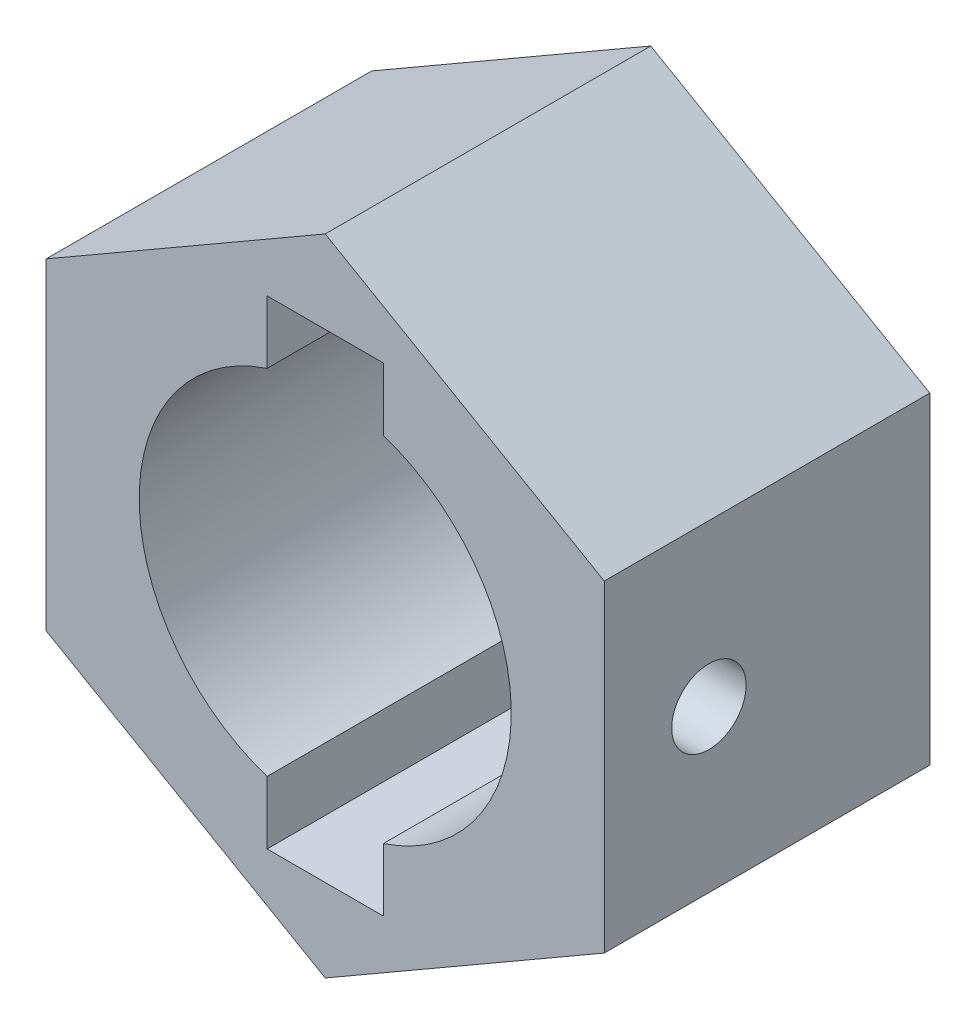
ISO-10303-21;
HEADER;
FILE_DESCRIPTION(('STEP AP214'),'2;1');
FILE_NAME('part.step','',(''),(''),'','','');
FILE_SCHEMA(('AUTOMOTIVE_DESIGN { 1 0 10303 214 1 1 1 1 }'));
ENDSEC;
DATA;
#1=APPLICATION_CONTEXT('core data for automotive mechanical design processes');
#2=APPLICATION_PROTOCOL_DEFINITION('international standard','automotive_design',2000,#1);
#3=PRODUCT_CONTEXT('',#1,'mechanical');
#4=PRODUCT('Part','Part','',(#3));
#5=PRODUCT_RELATED_PRODUCT_CATEGORY('part','',(#4));
#6=PRODUCT_DEFINITION_FORMATION('','',#4);
#7=PRODUCT_DEFINITION_CONTEXT('part definition',#1,'design');
#8=PRODUCT_DEFINITION('design','',#6,#7);
#9=PRODUCT_DEFINITION_SHAPE('','',#8);
#10=(LENGTH_UNIT() NAMED_UNIT(*) SI_UNIT(.MILLI.,.METRE.));
#11=(NAMED_UNIT(*) PLANE_ANGLE_UNIT() SI_UNIT($,.RADIAN.));
#12=(NAMED_UNIT(*) SI_UNIT($,.STERADIAN.) SOLID_ANGLE_UNIT());
#13=UNCERTAINTY_MEASURE_WITH_UNIT(LENGTH_MEASURE(1.E-05),#10,'distance_accuracy_value','');
#14=(GEOMETRIC_REPRESENTATION_CONTEXT(3) GLOBAL_UNCERTAINTY_ASSIGNED_CONTEXT((#13)) GLOBAL_UNIT_ASSIGNED_CONTEXT((#10,
#11,#12)) REPRESENTATION_CONTEXT('',''));
#15=CARTESIAN_POINT('',(0.,0.,0.));
#16=DIRECTION('',(0.,0.,1.));
#17=DIRECTION('',(1.,0.,0.));
#18=AXIS2_PLACEMENT_3D('',#15,#16,#17);
#19=CARTESIAN_POINT('',(12.,0.,14.));
#20=DIRECTION('',(-1.,0.,0.));
#21=DIRECTION('',(0.,-1.,0.));
#22=AXIS2_PLACEMENT_3D('',#19,#20,#21);
#23=PLANE('',#22);
#24=CARTESIAN_POINT('',(12.,0.,9.5));
#25=DIRECTION('',(1.,0.,0.));
#26=DIRECTION('',(0.,0.,-1.));
#27=AXIS2_PLACEMENT_3D('',#24,#25,#26);
#28=CIRCLE('',#27,1.6);
#29=CARTESIAN_POINT('',(12.,0.,7.9));
#30=VERTEX_POINT('',#29);
#31=EDGE_CURVE('E311',#30,#30,#28,.T.);
#32=ORIENTED_EDGE('',*,*,#31,.F.);
#33=EDGE_LOOP('',(#32));
#34=FACE_BOUND('',#33,.T.);
#35=DIRECTION('',(0.,1.,0.));
#36=VECTOR('',#35,1.);
#37=CARTESIAN_POINT('',(12.,0.,0.));
#38=LINE('',#37,#36);
#39=CARTESIAN_POINT('',(12.,-6.9282032302755,0.));
#40=VERTEX_POINT('',#39);
#41=CARTESIAN_POINT('',(12.,6.92820323027551,0.));
#42=VERTEX_POINT('',#41);
#43=EDGE_CURVE('E212',#40,#42,#38,.T.);
#44=ORIENTED_EDGE('',*,*,#43,.T.);
#45=DIRECTION('',(0.,0.,-1.));
#46=VECTOR('',#45,1.);
#47=CARTESIAN_POINT('',(12.,6.92820323027551,14.));
#48=LINE('',#47,#46);
#49=CARTESIAN_POINT('',(12.,6.92820323027551,14.));
#50=VERTEX_POINT('',#49);
#51=EDGE_CURVE('E11',#50,#42,#48,.T.);
#52=ORIENTED_EDGE('',*,*,#51,.F.);
#53=DIRECTION('',(0.,1.,0.));
#54=VECTOR('',#53,1.);
#55=CARTESIAN_POINT('',(12.,0.,14.));
#56=LINE('',#55,#54);
#57=CARTESIAN_POINT('',(12.,-6.9282032302755,14.));
#58=VERTEX_POINT('',#57);
#59=EDGE_CURVE('E397',#58,#50,#56,.T.);
#60=ORIENTED_EDGE('',*,*,#59,.F.);
#61=DIRECTION('',(0.,0.,-1.));
#62=VECTOR('',#61,1.);
#63=CARTESIAN_POINT('',(12.,-6.9282032302755,14.));
#64=LINE('',#63,#62);
#65=EDGE_CURVE('E229',#58,#40,#64,.T.);
#66=ORIENTED_EDGE('',*,*,#65,.T.);
#67=EDGE_LOOP('',(#44,#52,#60,#66));
#68=FACE_BOUND('',#67,.T.);
#69=ADVANCED_FACE('F42',(#34,#68),#23,.F.);
#70=CARTESIAN_POINT('',(6.00000000000001,10.3923048454133,14.));
#71=DIRECTION('',(-0.5,-0.866025403784438,0.));
#72=DIRECTION('',(0.866025403784438,-0.5,0.));
#73=AXIS2_PLACEMENT_3D('',#70,#71,#72);
#74=PLANE('',#73);
#75=DIRECTION('',(-0.866025403784438,0.5,0.));
#76=VECTOR('',#75,1.);
#77=CARTESIAN_POINT('',(6.00000000000001,10.3923048454133,0.));
#78=LINE('',#77,#76);
#79=CARTESIAN_POINT('',(0.,13.856406460551,0.));
#80=VERTEX_POINT('',#79);
#81=EDGE_CURVE('E216',#42,#80,#78,.T.);
#82=ORIENTED_EDGE('',*,*,#81,.T.);
#83=DIRECTION('',(0.,0.,-1.));
#84=VECTOR('',#83,1.);
#85=CARTESIAN_POINT('',(0.,13.856406460551,14.));
#86=LINE('',#85,#84);
#87=CARTESIAN_POINT('',(0.,13.856406460551,14.));
#88=VERTEX_POINT('',#87);
#89=EDGE_CURVE('E53',#88,#80,#86,.T.);
#90=ORIENTED_EDGE('',*,*,#89,.F.);
#91=DIRECTION('',(-0.866025403784438,0.5,0.));
#92=VECTOR('',#91,1.);
#93=CARTESIAN_POINT('',(6.00000000000001,10.3923048454133,14.));
#94=LINE('',#93,#92);
#95=EDGE_CURVE('E400',#50,#88,#94,.T.);
#96=ORIENTED_EDGE('',*,*,#95,.F.);
#97=ORIENTED_EDGE('',*,*,#51,.T.);
#98=EDGE_LOOP('',(#82,#90,#96,#97));
#99=FACE_BOUND('',#98,.T.);
#100=ADVANCED_FACE('F345',(#99),#74,.F.);
#101=CARTESIAN_POINT('',(-6.00000000000001,10.3923048454133,14.));
#102=DIRECTION('',(0.500000000000001,-0.866025403784438,0.));
#103=DIRECTION('',(0.866025403784438,0.500000000000001,0.));
#104=AXIS2_PLACEMENT_3D('',#101,#102,#103);
#105=PLANE('',#104);
#106=DIRECTION('',(-0.866025403784438,-0.500000000000001,0.));
#107=VECTOR('',#106,1.);
#108=CARTESIAN_POINT('',(-6.00000000000001,10.3923048454133,0.));
#109=LINE('',#108,#107);
#110=CARTESIAN_POINT('',(-12.,6.92820323027551,0.));
#111=VERTEX_POINT('',#110);
#112=EDGE_CURVE('E219',#80,#111,#109,.T.);
#113=ORIENTED_EDGE('',*,*,#112,.T.);
#114=DIRECTION('',(0.,0.,-1.));
#115=VECTOR('',#114,1.);
#116=CARTESIAN_POINT('',(-12.,6.92820323027551,14.));
#117=LINE('',#116,#115);
#118=CARTESIAN_POINT('',(-12.,6.92820323027551,14.));
#119=VERTEX_POINT('',#118);
#120=EDGE_CURVE('E172',#119,#111,#117,.T.);
#121=ORIENTED_EDGE('',*,*,#120,.F.);
#122=DIRECTION('',(-0.866025403784438,-0.500000000000001,0.));
#123=VECTOR('',#122,1.);
#124=CARTESIAN_POINT('',(-6.00000000000001,10.3923048454133,14.));
#125=LINE('',#124,#123);
#126=EDGE_CURVE('E161',#88,#119,#125,.T.);
#127=ORIENTED_EDGE('',*,*,#126,.F.);
#128=ORIENTED_EDGE('',*,*,#89,.T.);
#129=EDGE_LOOP('',(#113,#121,#127,#128));
#130=FACE_BOUND('',#129,.T.);
#131=ADVANCED_FACE('F351',(#130),#105,.F.);
#132=CARTESIAN_POINT('',(-12.,0.,14.));
#133=DIRECTION('',(1.,0.,0.));
#134=DIRECTION('',(0.,1.,0.));
#135=AXIS2_PLACEMENT_3D('',#132,#133,#134);
#136=PLANE('',#135);
#137=CARTESIAN_POINT('',(-12.,0.,2.));
#138=DIRECTION('',(-1.,0.,0.));
#139=DIRECTION('',(0.,0.,1.));
#140=AXIS2_PLACEMENT_3D('',#137,#138,#139);
#141=CIRCLE('',#140,0.799999999999999);
#142=CARTESIAN_POINT('',(-12.,0.,2.8));
#143=VERTEX_POINT('',#142);
#144=EDGE_CURVE('E321',#143,#143,#141,.T.);
#145=ORIENTED_EDGE('',*,*,#144,.F.);
#146=EDGE_LOOP('',(#145));
#147=FACE_BOUND('',#146,.T.);
#148=DIRECTION('',(0.,-1.,0.));
#149=VECTOR('',#148,1.);
#150=CARTESIAN_POINT('',(-12.,0.,0.));
#151=LINE('',#150,#149);
#152=CARTESIAN_POINT('',(-12.,-6.92820323027551,0.));
#153=VERTEX_POINT('',#152);
#154=EDGE_CURVE('E170',#111,#153,#151,.T.);
#155=ORIENTED_EDGE('',*,*,#154,.T.);
#156=DIRECTION('',(0.,0.,-1.));
#157=VECTOR('',#156,1.);
#158=CARTESIAN_POINT('',(-12.,-6.92820323027551,14.));
#159=LINE('',#158,#157);
#160=CARTESIAN_POINT('',(-12.,-6.92820323027551,14.));
#161=VERTEX_POINT('',#160);
#162=EDGE_CURVE('E167',#161,#153,#159,.T.);
#163=ORIENTED_EDGE('',*,*,#162,.F.);
#164=DIRECTION('',(0.,-1.,0.));
#165=VECTOR('',#164,1.);
#166=CARTESIAN_POINT('',(-12.,0.,14.));
#167=LINE('',#166,#165);
#168=EDGE_CURVE('E155',#119,#161,#167,.T.);
#169=ORIENTED_EDGE('',*,*,#168,.F.);
#170=ORIENTED_EDGE('',*,*,#120,.T.);
#171=EDGE_LOOP('',(#155,#163,#169,#170));
#172=FACE_BOUND('',#171,.T.);
#173=ADVANCED_FACE('F168',(#147,#172),#136,.F.);
#174=CARTESIAN_POINT('',(-6.00000000000001,-10.3923048454133,14.));
#175=DIRECTION('',(0.5,0.866025403784438,0.));
#176=DIRECTION('',(-0.866025403784438,0.5,0.));
#177=AXIS2_PLACEMENT_3D('',#174,#175,#176);
#178=PLANE('',#177);
#179=DIRECTION('',(0.866025403784438,-0.5,0.));
#180=VECTOR('',#179,1.);
#181=CARTESIAN_POINT('',(-6.00000000000001,-10.3923048454133,0.));
#182=LINE('',#181,#180);
#183=CARTESIAN_POINT('',(0.,-13.856406460551,0.));
#184=VERTEX_POINT('',#183);
#185=EDGE_CURVE('E109',#153,#184,#182,.T.);
#186=ORIENTED_EDGE('',*,*,#185,.T.);
#187=DIRECTION('',(0.,0.,-1.));
#188=VECTOR('',#187,1.);
#189=CARTESIAN_POINT('',(0.,-13.856406460551,14.));
#190=LINE('',#189,#188);
#191=CARTESIAN_POINT('',(0.,-13.856406460551,14.));
#192=VERTEX_POINT('',#191);
#193=EDGE_CURVE('E173',#192,#184,#190,.T.);
#194=ORIENTED_EDGE('',*,*,#193,.F.);
#195=DIRECTION('',(0.866025403784438,-0.5,0.));
#196=VECTOR('',#195,1.);
#197=CARTESIAN_POINT('',(-6.00000000000001,-10.3923048454133,14.));
#198=LINE('',#197,#196);
#199=EDGE_CURVE('E159',#161,#192,#198,.T.);
#200=ORIENTED_EDGE('',*,*,#199,.F.);
#201=ORIENTED_EDGE('',*,*,#162,.T.);
#202=EDGE_LOOP('',(#186,#194,#200,#201));
#203=FACE_BOUND('',#202,.T.);
#204=ADVANCED_FACE('F175',(#203),#178,.F.);
#205=CARTESIAN_POINT('',(0.,0.,14.));
#206=DIRECTION('',(0.,0.,-1.));
#207=DIRECTION('',(-1.,0.,0.));
#208=AXIS2_PLACEMENT_3D('',#205,#206,#207);
#209=CYLINDRICAL_SURFACE('',#208,8.);
#210=CARTESIAN_POINT('',(-8.,0.,2.8));
#211=CARTESIAN_POINT('',(-7.99999948416616,-0.0448162830332487,2.79999805927969));
#212=CARTESIAN_POINT('',(-7.99961940476965,-0.0896621961342213,2.79622138488284));
#213=CARTESIAN_POINT('',(-7.9981397407579,-0.178110718797472,2.78121250376766));
#214=CARTESIAN_POINT('',(-7.99703936347221,-0.221711903335065,2.76997208318033));
#215=CARTESIAN_POINT('',(-7.99424331650456,-0.306377340362734,2.74036620752173));
#216=CARTESIAN_POINT('',(-7.99254800640566,-0.34744310769193,2.72200505558522));
#217=CARTESIAN_POINT('',(-7.98875165915445,-0.425900928768328,2.67868727365468));
#218=CARTESIAN_POINT('',(-7.98665070270505,-0.463293711023264,2.65373195519989));
#219=CARTESIAN_POINT('',(-7.98226995473059,-0.533487640539268,2.59783784187018));
#220=CARTESIAN_POINT('',(-7.97998961259092,-0.566273715867916,2.56688016047837));
#221=CARTESIAN_POINT('',(-7.9755116552501,-0.626194017144789,2.49990037258957));
#222=CARTESIAN_POINT('',(-7.97331404387934,-0.653327981666124,2.46387803196609));
#223=CARTESIAN_POINT('',(-7.96924473242227,-0.701227176354895,2.3876971746531));
#224=CARTESIAN_POINT('',(-7.96737373368724,-0.721978772363906,2.34753004472411));
#225=CARTESIAN_POINT('',(-7.9641763003722,-0.75643710779421,2.26425953127602));
#226=CARTESIAN_POINT('',(-7.96284985233778,-0.770144021273035,2.22115622033284));
#227=CARTESIAN_POINT('',(-7.96089667258382,-0.790079233281517,2.13339055930719));
#228=CARTESIAN_POINT('',(-7.96026760318477,-0.796332522403038,2.08873393851823));
#229=CARTESIAN_POINT('',(-7.9597731444842,-0.80126022810829,1.99900090928338));
#230=CARTESIAN_POINT('',(-7.95990773510997,-0.799934843896643,1.95392451190235));
#231=CARTESIAN_POINT('',(-7.96092325519148,-0.789763424202145,1.86480375224535));
#232=CARTESIAN_POINT('',(-7.96180147672521,-0.780944675299644,1.82075624053704));
#233=CARTESIAN_POINT('',(-7.96420107429935,-0.756079315320471,1.73476962943913));
#234=CARTESIAN_POINT('',(-7.96572245902794,-0.740032606604599,1.69283055853998));
#235=CARTESIAN_POINT('',(-7.96924007561656,-0.701136715105208,1.61216513016089));
#236=CARTESIAN_POINT('',(-7.97123715126526,-0.678275426175985,1.57344464840855));
#237=CARTESIAN_POINT('',(-7.97548041386303,-0.626408021882584,1.50037982807049));
#238=CARTESIAN_POINT('',(-7.97772660810228,-0.597401726669206,1.46603561761459));
#239=CARTESIAN_POINT('',(-7.98222708250391,-0.533915289929657,1.40253968480878));
#240=CARTESIAN_POINT('',(-7.98448135466398,-0.499411583081093,1.37341151849536));
#241=CARTESIAN_POINT('',(-7.98873463262815,-0.425991585389692,1.32135709367169));
#242=CARTESIAN_POINT('',(-7.99073363814605,-0.387075289599683,1.29843084211482));
#243=CARTESIAN_POINT('',(-7.99425180533677,-0.305918484553894,1.2594319837518));
#244=CARTESIAN_POINT('',(-7.99577088331816,-0.263677397111925,1.24336057214555));
#245=CARTESIAN_POINT('',(-7.99815717953127,-0.177077773863948,1.2185448666306));
#246=CARTESIAN_POINT('',(-7.99902441725651,-0.132719301421283,1.2098003536075));
#247=CARTESIAN_POINT('',(-8.00000681334649,-0.0433480792735259,1.19991655381219));
#248=CARTESIAN_POINT('',(-8.00012518614188,0.00166104168439061,1.198744761398));
#249=CARTESIAN_POINT('',(-7.99960513405438,0.0912350346525567,1.20395429043901));
#250=CARTESIAN_POINT('',(-7.99896671939575,0.135799912656373,1.21033550985223));
#251=CARTESIAN_POINT('',(-7.99700689231355,0.223126565467736,1.23044295633726));
#252=CARTESIAN_POINT('',(-7.99568689534431,0.265891879177612,1.24415396358241));
#253=CARTESIAN_POINT('',(-7.99251199088487,0.348515457107022,1.27851613922982));
#254=CARTESIAN_POINT('',(-7.99065707140203,0.38837365612569,1.29916746323152));
#255=CARTESIAN_POINT('',(-7.98661180264338,0.46419854413771,1.34690467093113));
#256=CARTESIAN_POINT('',(-7.98442034882753,0.50015172779913,1.37401191114066));
#257=CARTESIAN_POINT('',(-7.97995146295616,0.567009298649499,1.43386085419274));
#258=CARTESIAN_POINT('',(-7.97767402874377,0.597913559079338,1.46660269845625));
#259=CARTESIAN_POINT('',(-7.97328019312604,0.653908887909712,1.5369332597272));
#260=CARTESIAN_POINT('',(-7.9711644011118,0.678978622943631,1.5745390052341));
#261=CARTESIAN_POINT('',(-7.96734265968712,0.722446606995058,1.65344588811735));
#262=CARTESIAN_POINT('',(-7.9656367046723,0.740844947243101,1.69474697495072));
#263=CARTESIAN_POINT('',(-7.9628315810724,0.770412166947576,1.77979899157264));
#264=CARTESIAN_POINT('',(-7.96173134759831,0.781593739849485,1.8235454720729));
#265=CARTESIAN_POINT('',(-7.96025892226301,0.796451205703566,1.91230655836862));
#266=CARTESIAN_POINT('',(-7.95988670952149,0.800127313919609,1.95732112775654));
#267=CARTESIAN_POINT('',(-7.9599129048605,0.799866510777001,2.04712855068536));
#268=CARTESIAN_POINT('',(-7.96030792069607,0.795963111674485,2.09192150630625));
#269=CARTESIAN_POINT('',(-7.96181683111637,0.780724362370918,2.18021193373463));
#270=CARTESIAN_POINT('',(-7.96293072650975,0.769389003809723,2.22370940408478));
#271=CARTESIAN_POINT('',(-7.9657509461055,0.739617349037998,2.30817387923829));
#272=CARTESIAN_POINT('',(-7.96745718832289,0.721182035472728,2.34914123330378));
#273=CARTESIAN_POINT('',(-7.97127001471487,0.677737243928831,2.42740551333683));
#274=CARTESIAN_POINT('',(-7.9733765966476,0.652727802764328,2.4647024598565));
#275=CARTESIAN_POINT('',(-7.97776389767758,0.596718845028261,2.53473893957755));
#276=CARTESIAN_POINT('',(-7.980045317814,0.565694359112211,2.56745846109367));
#277=CARTESIAN_POINT('',(-7.98451883783027,0.498585359380083,2.62724178615973));
#278=CARTESIAN_POINT('',(-7.98671091618381,0.462499635286602,2.65430423308574));
#279=CARTESIAN_POINT('',(-7.99076449655329,0.386193147329028,2.7020587630837));
#280=CARTESIAN_POINT('',(-7.9926251522145,0.345962199477407,2.72273463275614));
#281=CARTESIAN_POINT('',(-7.99579703399917,0.262606623280437,2.75700993825909));
#282=CARTESIAN_POINT('',(-7.99710887927723,0.219485319860484,2.77061735276284));
#283=CARTESIAN_POINT('',(-7.99870571018987,0.14676660912456,2.78697649366784));
#284=CARTESIAN_POINT('',(-7.99918880553466,0.117634042275604,2.79185363543948));
#285=CARTESIAN_POINT('',(-7.99983611960629,0.0590052646538476,2.79836602084941));
#286=CARTESIAN_POINT('',(-8.00000033964819,0.0295090553812434,2.80000127785749));
#287=CARTESIAN_POINT('',(-8.,0.,2.8));
#288=B_SPLINE_CURVE_WITH_KNOTS('',3,(#210,#211,#212,#213,#214,#215,#216,#217,#218,#219,#220,
#221,#222,#223,#224,#225,#226,#227,#228,#229,#230,#231,#232,#233,#234,#235,#236,#237,#238,#239,
#240,#241,#242,#243,#244,#245,#246,#247,#248,#249,#250,#251,#252,#253,#254,#255,#256,#257,#258,
#259,#260,#261,#262,#263,#264,#265,#266,#267,#268,#269,#270,#271,#272,#273,#274,#275,#276,#277,
#278,#279,#280,#281,#282,#283,#284,#285,#286,#287),.UNSPECIFIED.,.T.,.F.,(4,2,2,2,2,2,2,2,2,2,2,
2,2,2,2,2,2,2,2,2,2,2,2,2,2,2,2,2,2,2,2,2,2,2,2,2,2,2,4),(0.,0.134341093014779,
0.268830274268389,0.403238308585761,0.537619630066225,0.672430854898355,0.807248313765646,
0.942351803777773,1.07745195554003,1.21209785636157,1.34674021804621,1.48089437952888,
1.61505035329307,1.74944609098315,1.883845762649,2.01883787356965,2.15383013583817,
2.28884592554865,2.42385767740351,2.55828950886206,2.69271952415314,2.82687148235443,
2.96102644839573,3.09563152598958,3.23023998248183,3.36533314886878,3.50042446780299,
3.63527752474402,3.77012671391668,3.90438103435164,4.03863550580831,4.17287140290239,
4.30710654831167,4.44191133942122,4.57674842109565,4.71192504820993,4.84694875836235,
4.93540533785878,5.02386155255221),.UNSPECIFIED.);
#289=CARTESIAN_POINT('',(-8.,0.,2.8));
#290=VERTEX_POINT('',#289);
#291=EDGE_CURVE('E316',#290,#290,#288,.T.);
#292=ORIENTED_EDGE('',*,*,#291,.F.);
#293=EDGE_LOOP('',(#292));
#294=FACE_BOUND('',#293,.T.);
#295=CARTESIAN_POINT('',(0.,0.,0.));
#296=DIRECTION('',(0.,0.,1.));
#297=DIRECTION('',(1.,0.,0.));
#298=AXIS2_PLACEMENT_3D('',#295,#296,#297);
#299=CIRCLE('',#298,8.);
#300=CARTESIAN_POINT('',(-2.5,7.59934207678533,0.));
#301=VERTEX_POINT('',#300);
#302=CARTESIAN_POINT('',(-2.5,-7.59934207678533,0.));
#303=VERTEX_POINT('',#302);
#304=EDGE_CURVE('E184',#301,#303,#299,.T.);
#305=ORIENTED_EDGE('',*,*,#304,.F.);
#306=DIRECTION('',(0.,0.,-1.));
#307=VECTOR('',#306,1.);
#308=CARTESIAN_POINT('',(-2.5,7.59934207678533,14.));
#309=LINE('',#308,#307);
#310=CARTESIAN_POINT('',(-2.5,7.59934207678533,14.));
#311=VERTEX_POINT('',#310);
#312=EDGE_CURVE('E46',#311,#301,#309,.T.);
#313=ORIENTED_EDGE('',*,*,#312,.F.);
#314=CARTESIAN_POINT('',(0.,0.,14.));
#315=DIRECTION('',(0.,0.,1.));
#316=DIRECTION('',(1.,0.,0.));
#317=AXIS2_PLACEMENT_3D('',#314,#315,#316);
#318=CIRCLE('',#317,8.);
#319=CARTESIAN_POINT('',(-2.5,-7.59934207678533,14.));
#320=VERTEX_POINT('',#319);
#321=EDGE_CURVE('E228',#311,#320,#318,.T.);
#322=ORIENTED_EDGE('',*,*,#321,.T.);
#323=DIRECTION('',(0.,0.,-1.));
#324=VECTOR('',#323,1.);
#325=CARTESIAN_POINT('',(-2.5,-7.59934207678533,14.));
#326=LINE('',#325,#324);
#327=EDGE_CURVE('E180',#320,#303,#326,.T.);
#328=ORIENTED_EDGE('',*,*,#327,.T.);
#329=EDGE_LOOP('',(#305,#313,#322,#328));
#330=FACE_BOUND('',#329,.T.);
#331=ADVANCED_FACE('F275',(#294,#330),#209,.F.);
#332=CARTESIAN_POINT('',(-2.5,0.,14.));
#333=DIRECTION('',(-1.,0.,0.));
#334=DIRECTION('',(0.,0.,1.));
#335=AXIS2_PLACEMENT_3D('',#332,#333,#334);
#336=PLANE('',#335);
#337=DIRECTION('',(0.,1.,0.));
#338=VECTOR('',#337,1.);
#339=CARTESIAN_POINT('',(-2.5,0.,0.));
#340=LINE('',#339,#338);
#341=CARTESIAN_POINT('',(-2.5,10.3,0.));
#342=VERTEX_POINT('',#341);
#343=EDGE_CURVE('E188',#301,#342,#340,.T.);
#344=ORIENTED_EDGE('',*,*,#343,.T.);
#345=DIRECTION('',(0.,0.,-1.));
#346=VECTOR('',#345,1.);
#347=CARTESIAN_POINT('',(-2.5,10.3,14.));
#348=LINE('',#347,#346);
#349=CARTESIAN_POINT('',(-2.5,10.3,14.));
#350=VERTEX_POINT('',#349);
#351=EDGE_CURVE('E256',#350,#342,#348,.T.);
#352=ORIENTED_EDGE('',*,*,#351,.F.);
#353=DIRECTION('',(0.,1.,0.));
#354=VECTOR('',#353,1.);
#355=CARTESIAN_POINT('',(-2.5,0.,14.));
#356=LINE('',#355,#354);
#357=EDGE_CURVE('E268',#311,#350,#356,.T.);
#358=ORIENTED_EDGE('',*,*,#357,.F.);
#359=ORIENTED_EDGE('',*,*,#312,.T.);
#360=EDGE_LOOP('',(#344,#352,#358,#359));
#361=FACE_BOUND('',#360,.T.);
#362=ADVANCED_FACE('F44',(#361),#336,.F.);
#363=CARTESIAN_POINT('',(0.,10.3,14.));
#364=DIRECTION('',(0.,1.,0.));
#365=DIRECTION('',(0.,0.,1.));
#366=AXIS2_PLACEMENT_3D('',#363,#364,#365);
#367=PLANE('',#366);
#368=DIRECTION('',(1.,0.,0.));
#369=VECTOR('',#368,1.);
#370=CARTESIAN_POINT('',(0.,10.3,0.));
#371=LINE('',#370,#369);
#372=CARTESIAN_POINT('',(2.5,10.3,0.));
#373=VERTEX_POINT('',#372);
#374=EDGE_CURVE('E193',#342,#373,#371,.T.);
#375=ORIENTED_EDGE('',*,*,#374,.T.);
#376=DIRECTION('',(0.,0.,-1.));
#377=VECTOR('',#376,1.);
#378=CARTESIAN_POINT('',(2.5,10.3,14.));
#379=LINE('',#378,#377);
#380=CARTESIAN_POINT('',(2.5,10.3,14.));
#381=VERTEX_POINT('',#380);
#382=EDGE_CURVE('E253',#381,#373,#379,.T.);
#383=ORIENTED_EDGE('',*,*,#382,.F.);
#384=DIRECTION('',(1.,0.,0.));
#385=VECTOR('',#384,1.);
#386=CARTESIAN_POINT('',(0.,10.3,14.));
#387=LINE('',#386,#385);
#388=EDGE_CURVE('E382',#350,#381,#387,.T.);
#389=ORIENTED_EDGE('',*,*,#388,.F.);
#390=ORIENTED_EDGE('',*,*,#351,.T.);
#391=EDGE_LOOP('',(#375,#383,#389,#390));
#392=FACE_BOUND('',#391,.T.);
#393=ADVANCED_FACE('F370',(#392),#367,.F.);
#394=CARTESIAN_POINT('',(2.5,0.,14.));
#395=DIRECTION('',(1.,0.,0.));
#396=DIRECTION('',(0.,1.,0.));
#397=AXIS2_PLACEMENT_3D('',#394,#395,#396);
#398=PLANE('',#397);
#399=DIRECTION('',(0.,-1.,0.));
#400=VECTOR('',#399,1.);
#401=CARTESIAN_POINT('',(2.5,0.,0.));
#402=LINE('',#401,#400);
#403=CARTESIAN_POINT('',(2.5,7.59934207678533,0.));
#404=VERTEX_POINT('',#403);
#405=EDGE_CURVE('E196',#373,#404,#402,.T.);
#406=ORIENTED_EDGE('',*,*,#405,.T.);
#407=DIRECTION('',(0.,0.,-1.));
#408=VECTOR('',#407,1.);
#409=CARTESIAN_POINT('',(2.5,7.59934207678533,14.));
#410=LINE('',#409,#408);
#411=CARTESIAN_POINT('',(2.5,7.59934207678533,14.));
#412=VERTEX_POINT('',#411);
#413=EDGE_CURVE('E250',#412,#404,#410,.T.);
#414=ORIENTED_EDGE('',*,*,#413,.F.);
#415=DIRECTION('',(0.,-1.,0.));
#416=VECTOR('',#415,1.);
#417=CARTESIAN_POINT('',(2.5,0.,14.));
#418=LINE('',#417,#416);
#419=EDGE_CURVE('E378',#381,#412,#418,.T.);
#420=ORIENTED_EDGE('',*,*,#419,.F.);
#421=ORIENTED_EDGE('',*,*,#382,.T.);
#422=EDGE_LOOP('',(#406,#414,#420,#421));
#423=FACE_BOUND('',#422,.T.);
#424=ADVANCED_FACE('F367',(#423),#398,.F.);
#425=CARTESIAN_POINT('',(8.,0.,7.9));
#426=CARTESIAN_POINT('',(7.99999836129394,-0.0889230508682048,7.90000327119735));
#427=CARTESIAN_POINT('',(7.9985021628517,-0.177887456322427,7.90743814874823));
#428=CARTESIAN_POINT('',(7.9926778499717,-0.353301612302422,7.93695760018439));
#429=CARTESIAN_POINT('',(7.98834748576298,-0.43974930806616,7.95905381248242));
#430=CARTESIAN_POINT('',(7.97733838845259,-0.607568488421292,8.01718603779326));
#431=CARTESIAN_POINT('',(7.97066190522749,-0.688944748693006,8.0532086989515));
#432=CARTESIAN_POINT('',(7.95568636856503,-0.844492782182752,8.13813159601807));
#433=CARTESIAN_POINT('',(7.94738741177131,-0.918664984121289,8.18703106497153));
#434=CARTESIAN_POINT('',(7.92995464527952,-1.05870956370377,8.2970215908663));
#435=CARTESIAN_POINT('',(7.92081192806956,-1.12447032185363,8.35825336862592));
#436=CARTESIAN_POINT('',(7.90278688724142,-1.24485881057284,8.49086786622672));
#437=CARTESIAN_POINT('',(7.89390458400678,-1.29948567163267,8.56225137813619));
#438=CARTESIAN_POINT('',(7.87731906900185,-1.39653080535618,8.713945908819));
#439=CARTESIAN_POINT('',(7.86962731783914,-1.43883350218538,8.79433223007418));
#440=CARTESIAN_POINT('',(7.85642028893469,-1.50928906652848,8.96125091040653));
#441=CARTESIAN_POINT('',(7.85090479619139,-1.53744333189957,9.04778266135415));
#442=CARTESIAN_POINT('',(7.84276488403527,-1.57844047981571,9.22333498225267));
#443=CARTESIAN_POINT('',(7.840103521715,-1.59147919673403,9.31230807062756));
#444=CARTESIAN_POINT('',(7.83786200097004,-1.60248340436178,9.49121571418295));
#445=CARTESIAN_POINT('',(7.83828152748545,-1.60045043634159,9.58115017011223));
#446=CARTESIAN_POINT('',(7.84212081837096,-1.5815273169629,9.75799486083361));
#447=CARTESIAN_POINT('',(7.84549524574022,-1.56486166439024,9.8449302490037));
#448=CARTESIAN_POINT('',(7.85479273856002,-1.51750061539687,10.0147457226608));
#449=CARTESIAN_POINT('',(7.86071592572446,-1.48680454896108,10.0976256142704));
#450=CARTESIAN_POINT('',(7.87448989600653,-1.41203965387954,10.2576244187258));
#451=CARTESIAN_POINT('',(7.88235343701927,-1.36788184197137,10.3347006073107));
#452=CARTESIAN_POINT('',(7.89911390036899,-1.26750971931628,10.4804333599565));
#453=CARTESIAN_POINT('',(7.90801094141386,-1.21129402297092,10.5490889549619));
#454=CARTESIAN_POINT('',(7.92603233986339,-1.08719989529693,10.6773270439311));
#455=CARTESIAN_POINT('',(7.93515790737448,-1.0191298579399,10.7367241085746));
#456=CARTESIAN_POINT('',(7.95246157943054,-0.873896038499206,10.843286154082));
#457=CARTESIAN_POINT('',(7.96063967182358,-0.796732139807013,10.8904509780697));
#458=CARTESIAN_POINT('',(7.97514704257419,-0.635295019006264,10.9712440147616));
#459=CARTESIAN_POINT('',(7.98147342157235,-0.551010911336471,11.0048510298313));
#460=CARTESIAN_POINT('',(7.99154254380573,-0.377838362317855,11.0573767584617));
#461=CARTESIAN_POINT('',(7.9952856000085,-0.288950480115911,11.0762972513178));
#462=CARTESIAN_POINT('',(7.99972274986989,-0.110687049003433,11.0986503260708));
#463=CARTESIAN_POINT('',(8.00046679443952,-0.0213445253209144,11.1023366712644));
#464=CARTESIAN_POINT('',(7.99896083088164,0.15667989470835,11.0948002256925));
#465=CARTESIAN_POINT('',(7.99671099106314,0.245361827910077,11.0835782730358));
#466=CARTESIAN_POINT('',(7.98950131212828,0.418729055914473,11.0467546023297));
#467=CARTESIAN_POINT('',(7.9845660224673,0.503443117343853,11.0212830904034));
#468=CARTESIAN_POINT('',(7.97253683297652,0.667397803999475,10.9568256277507));
#469=CARTESIAN_POINT('',(7.96544277142762,0.746638018620071,10.9178386645171));
#470=CARTESIAN_POINT('',(7.94975858453271,0.898465877897956,10.8269080149579));
#471=CARTESIAN_POINT('',(7.94115120699283,0.970960202803509,10.7748115503377));
#472=CARTESIAN_POINT('',(7.92343575727812,1.10626883059074,10.6593452940684));
#473=CARTESIAN_POINT('',(7.9143276314942,1.16908209428923,10.5959742937602));
#474=CARTESIAN_POINT('',(7.89646885691144,1.28422494523869,10.4586026369742));
#475=CARTESIAN_POINT('',(7.88772576373287,1.33638032391786,10.3844548092459));
#476=CARTESIAN_POINT('',(7.87174706873911,1.42749667208194,10.2283018218293));
#477=CARTESIAN_POINT('',(7.86451140661348,1.46645816947665,10.1462969766823));
#478=CARTESIAN_POINT('',(7.85242784935012,1.52984294653114,9.97717080616072));
#479=CARTESIAN_POINT('',(7.84756759795498,1.55434159966569,9.89007865406349));
#480=CARTESIAN_POINT('',(7.8407589886724,1.58833384260352,9.71290647441455));
#481=CARTESIAN_POINT('',(7.83881025105778,1.59782938916019,9.62282683806504));
#482=CARTESIAN_POINT('',(7.83806639410206,1.60147345738796,9.44398581672909));
#483=CARTESIAN_POINT('',(7.83921470702881,1.59589726091344,9.35523016171678));
#484=CARTESIAN_POINT('',(7.84440917575382,1.5701636865601,9.17994936015196));
#485=CARTESIAN_POINT('',(7.8484553082747,1.55000642580688,9.09342419568831));
#486=CARTESIAN_POINT('',(7.85896422750654,1.49580570959833,8.92523566201513));
#487=CARTESIAN_POINT('',(7.86542113630129,1.46179601074776,8.84356102319614));
#488=CARTESIAN_POINT('',(7.88002743958672,1.38088743136257,8.6870340468249));
#489=CARTESIAN_POINT('',(7.8881769759823,1.33398747003982,8.61218228203978));
#490=CARTESIAN_POINT('',(7.9054233683716,1.22768946365827,8.4700550845595));
#491=CARTESIAN_POINT('',(7.91453396655519,1.1680926195763,8.40292997557185));
#492=CARTESIAN_POINT('',(7.93257730995127,1.03850299042103,8.27954207115333));
#493=CARTESIAN_POINT('',(7.94151001381095,0.968507819445344,8.22328177549237));
#494=CARTESIAN_POINT('',(7.95830131820754,0.819228206541203,8.12266456968569));
#495=CARTESIAN_POINT('',(7.96614769950794,0.739854215087744,8.07843839475196));
#496=CARTESIAN_POINT('',(7.97976200136,0.574666177505181,8.00402220384545));
#497=CARTESIAN_POINT('',(7.98553179421785,0.488858017381011,7.97381953674801));
#498=CARTESIAN_POINT('',(7.99322196152593,0.335714382278056,7.93415688312846));
#499=CARTESIAN_POINT('',(7.99574885053523,0.269250662422065,7.92137089006759));
#500=CARTESIAN_POINT('',(7.99913846623828,0.135199240336116,7.90429134022662));
#501=CARTESIAN_POINT('',(8.00000124597048,0.0676115739977991,7.89999751278437));
#502=CARTESIAN_POINT('',(8.,0.,7.9));
#503=B_SPLINE_CURVE_WITH_KNOTS('',3,(#425,#426,#427,#428,#429,#430,#431,#432,#433,#434,#435,
#436,#437,#438,#439,#440,#441,#442,#443,#444,#445,#446,#447,#448,#449,#450,#451,#452,#453,#454,
#455,#456,#457,#458,#459,#460,#461,#462,#463,#464,#465,#466,#467,#468,#469,#470,#471,#472,#473,
#474,#475,#476,#477,#478,#479,#480,#481,#482,#483,#484,#485,#486,#487,#488,#489,#490,#491,#492,
#493,#494,#495,#496,#497,#498,#499,#500,#501,#502),.UNSPECIFIED.,.T.,.F.,(4,2,2,2,2,2,2,2,2,2,2,
2,2,2,2,2,2,2,2,2,2,2,2,2,2,2,2,2,2,2,2,2,2,2,2,2,2,2,4),(0.,0.266521809058013,
0.533255441106116,0.799733976400546,1.06619664356938,1.3358922721795,1.60560895479578,
1.87777912009476,2.14992238984316,2.4184989616574,2.6870480684996,2.95154763210045,
3.21605982805967,3.48235984325748,3.74869047599473,4.01981203986161,4.29093708063712,
4.56248439766438,4.83399881116857,5.10097177082024,5.36792972252588,5.63248726321157,
5.89706462745636,6.16488105653373,6.43272621353488,6.70465005726761,6.97656301957546,
7.24704609652357,7.51749389328663,7.78303556108322,8.04857509588173,8.31347138004975,
8.57838988130986,8.84780921982628,9.11729047252688,9.38959194681019,9.66164728828029,
9.8643004046383,10.0669470619359),.UNSPECIFIED.);
#504=CARTESIAN_POINT('',(8.,0.,7.9));
#505=VERTEX_POINT('',#504);
#506=EDGE_CURVE('E189',#505,#505,#503,.T.);
#507=ORIENTED_EDGE('',*,*,#506,.F.);
#508=EDGE_LOOP('',(#507));
#509=FACE_BOUND('',#508,.T.);
#510=CARTESIAN_POINT('',(2.5,-7.59934207678533,0.));
#511=VERTEX_POINT('',#510);
#512=EDGE_CURVE('E190',#511,#404,#299,.T.);
#513=ORIENTED_EDGE('',*,*,#512,.F.);
#514=DIRECTION('',(0.,0.,-1.));
#515=VECTOR('',#514,1.);
#516=CARTESIAN_POINT('',(2.5,-7.59934207678533,14.));
#517=LINE('',#516,#515);
#518=CARTESIAN_POINT('',(2.5,-7.59934207678533,14.));
#519=VERTEX_POINT('',#518);
#520=EDGE_CURVE('E247',#519,#511,#517,.T.);
#521=ORIENTED_EDGE('',*,*,#520,.F.);
#522=EDGE_CURVE('E381',#519,#412,#318,.T.);
#523=ORIENTED_EDGE('',*,*,#522,.T.);
#524=ORIENTED_EDGE('',*,*,#413,.T.);
#525=EDGE_LOOP('',(#513,#521,#523,#524));
#526=FACE_BOUND('',#525,.T.);
#527=ADVANCED_FACE('F298',(#509,#526),#209,.F.);
#528=CARTESIAN_POINT('',(2.49999999999999,0.,14.));
#529=DIRECTION('',(-1.,0.,0.));
#530=DIRECTION('',(0.,-1.,0.));
#531=AXIS2_PLACEMENT_3D('',#528,#529,#530);
#532=PLANE('',#531);
#533=DIRECTION('',(0.,1.,0.));
#534=VECTOR('',#533,1.);
#535=CARTESIAN_POINT('',(2.49999999999999,0.,0.));
#536=LINE('',#535,#534);
#537=CARTESIAN_POINT('',(2.5,-10.3,0.));
#538=VERTEX_POINT('',#537);
#539=EDGE_CURVE('E200',#538,#511,#536,.T.);
#540=ORIENTED_EDGE('',*,*,#539,.F.);
#541=DIRECTION('',(0.,0.,-1.));
#542=VECTOR('',#541,1.);
#543=CARTESIAN_POINT('',(2.5,-10.3,14.));
#544=LINE('',#543,#542);
#545=CARTESIAN_POINT('',(2.5,-10.3,14.));
#546=VERTEX_POINT('',#545);
#547=EDGE_CURVE('E244',#546,#538,#544,.T.);
#548=ORIENTED_EDGE('',*,*,#547,.F.);
#549=DIRECTION('',(0.,1.,0.));
#550=VECTOR('',#549,1.);
#551=CARTESIAN_POINT('',(2.49999999999999,0.,14.));
#552=LINE('',#551,#550);
#553=EDGE_CURVE('E294',#546,#519,#552,.T.);
#554=ORIENTED_EDGE('',*,*,#553,.T.);
#555=ORIENTED_EDGE('',*,*,#520,.T.);
#556=EDGE_LOOP('',(#540,#548,#554,#555));
#557=FACE_BOUND('',#556,.T.);
#558=ADVANCED_FACE('F292',(#557),#532,.T.);
#559=CARTESIAN_POINT('',(0.,-10.3,14.));
#560=DIRECTION('',(0.,1.,0.));
#561=DIRECTION('',(0.,0.,1.));
#562=AXIS2_PLACEMENT_3D('',#559,#560,#561);
#563=PLANE('',#562);
#564=DIRECTION('',(1.,0.,0.));
#565=VECTOR('',#564,1.);
#566=CARTESIAN_POINT('',(0.,-10.3,0.));
#567=LINE('',#566,#565);
#568=CARTESIAN_POINT('',(-2.5,-10.3,0.));
#569=VERTEX_POINT('',#568);
#570=EDGE_CURVE('E204',#569,#538,#567,.T.);
#571=ORIENTED_EDGE('',*,*,#570,.F.);
#572=DIRECTION('',(0.,0.,-1.));
#573=VECTOR('',#572,1.);
#574=CARTESIAN_POINT('',(-2.5,-10.3,14.));
#575=LINE('',#574,#573);
#576=CARTESIAN_POINT('',(-2.5,-10.3,14.));
#577=VERTEX_POINT('',#576);
#578=EDGE_CURVE('E241',#577,#569,#575,.T.);
#579=ORIENTED_EDGE('',*,*,#578,.F.);
#580=DIRECTION('',(1.,0.,0.));
#581=VECTOR('',#580,1.);
#582=CARTESIAN_POINT('',(0.,-10.3,14.));
#583=LINE('',#582,#581);
#584=EDGE_CURVE('E288',#577,#546,#583,.T.);
#585=ORIENTED_EDGE('',*,*,#584,.T.);
#586=ORIENTED_EDGE('',*,*,#547,.T.);
#587=EDGE_LOOP('',(#571,#579,#585,#586));
#588=FACE_BOUND('',#587,.T.);
#589=ADVANCED_FACE('F285',(#588),#563,.T.);
#590=CARTESIAN_POINT('',(-2.5,0.,14.));
#591=DIRECTION('',(1.,0.,0.));
#592=DIRECTION('',(0.,1.,0.));
#593=AXIS2_PLACEMENT_3D('',#590,#591,#592);
#594=PLANE('',#593);
#595=DIRECTION('',(0.,-1.,0.));
#596=VECTOR('',#595,1.);
#597=CARTESIAN_POINT('',(-2.5,0.,0.));
#598=LINE('',#597,#596);
#599=EDGE_CURVE('E208',#303,#569,#598,.T.);
#600=ORIENTED_EDGE('',*,*,#599,.F.);
#601=ORIENTED_EDGE('',*,*,#327,.F.);
#602=DIRECTION('',(0.,-1.,0.));
#603=VECTOR('',#602,1.);
#604=CARTESIAN_POINT('',(-2.5,0.,14.));
#605=LINE('',#604,#603);
#606=EDGE_CURVE('E280',#320,#577,#605,.T.);
#607=ORIENTED_EDGE('',*,*,#606,.T.);
#608=ORIENTED_EDGE('',*,*,#578,.T.);
#609=EDGE_LOOP('',(#600,#601,#607,#608));
#610=FACE_BOUND('',#609,.T.);
#611=ADVANCED_FACE('F279',(#610),#594,.T.);
#612=CARTESIAN_POINT('',(6.00000000000001,-10.3923048454133,14.));
#613=DIRECTION('',(-0.500000000000001,0.866025403784438,0.));
#614=DIRECTION('',(-0.866025403784438,-0.500000000000001,0.));
#615=AXIS2_PLACEMENT_3D('',#612,#613,#614);
#616=PLANE('',#615);
#617=DIRECTION('',(0.866025403784438,0.500000000000001,0.));
#618=VECTOR('',#617,1.);
#619=CARTESIAN_POINT('',(6.00000000000001,-10.3923048454133,0.));
#620=LINE('',#619,#618);
#621=EDGE_CURVE('E115',#184,#40,#620,.T.);
#622=ORIENTED_EDGE('',*,*,#621,.T.);
#623=ORIENTED_EDGE('',*,*,#65,.F.);
#624=DIRECTION('',(0.866025403784438,0.500000000000001,0.));
#625=VECTOR('',#624,1.);
#626=CARTESIAN_POINT('',(6.00000000000001,-10.3923048454133,14.));
#627=LINE('',#626,#625);
#628=EDGE_CURVE('E62',#192,#58,#627,.T.);
#629=ORIENTED_EDGE('',*,*,#628,.F.);
#630=ORIENTED_EDGE('',*,*,#193,.T.);
#631=EDGE_LOOP('',(#622,#623,#629,#630));
#632=FACE_BOUND('',#631,.T.);
#633=ADVANCED_FACE('F360',(#632),#616,.F.);
#634=CARTESIAN_POINT('',(0.,0.,14.));
#635=DIRECTION('',(0.,0.,1.));
#636=DIRECTION('',(1.,0.,0.));
#637=AXIS2_PLACEMENT_3D('',#634,#635,#636);
#638=PLANE('',#637);
#639=ORIENTED_EDGE('',*,*,#321,.F.);
#640=ORIENTED_EDGE('',*,*,#357,.T.);
#641=ORIENTED_EDGE('',*,*,#388,.T.);
#642=ORIENTED_EDGE('',*,*,#419,.T.);
#643=ORIENTED_EDGE('',*,*,#522,.F.);
#644=ORIENTED_EDGE('',*,*,#553,.F.);
#645=ORIENTED_EDGE('',*,*,#584,.F.);
#646=ORIENTED_EDGE('',*,*,#606,.F.);
#647=EDGE_LOOP('',(#639,#640,#641,#642,#643,#644,#645,#646));
#648=FACE_BOUND('',#647,.T.);
#649=ORIENTED_EDGE('',*,*,#59,.T.);
#650=ORIENTED_EDGE('',*,*,#95,.T.);
#651=ORIENTED_EDGE('',*,*,#126,.T.);
#652=ORIENTED_EDGE('',*,*,#168,.T.);
#653=ORIENTED_EDGE('',*,*,#199,.T.);
#654=ORIENTED_EDGE('',*,*,#628,.T.);
#655=EDGE_LOOP('',(#649,#650,#651,#652,#653,#654));
#656=FACE_BOUND('',#655,.T.);
#657=ADVANCED_FACE('F157',(#648,#656),#638,.T.);
#658=CARTESIAN_POINT('',(0.,0.,0.));
#659=DIRECTION('',(0.,0.,1.));
#660=DIRECTION('',(1.,0.,0.));
#661=AXIS2_PLACEMENT_3D('',#658,#659,#660);
#662=PLANE('',#661);
#663=ORIENTED_EDGE('',*,*,#304,.T.);
#664=ORIENTED_EDGE('',*,*,#599,.T.);
#665=ORIENTED_EDGE('',*,*,#570,.T.);
#666=ORIENTED_EDGE('',*,*,#539,.T.);
#667=ORIENTED_EDGE('',*,*,#512,.T.);
#668=ORIENTED_EDGE('',*,*,#405,.F.);
#669=ORIENTED_EDGE('',*,*,#374,.F.);
#670=ORIENTED_EDGE('',*,*,#343,.F.);
#671=EDGE_LOOP('',(#663,#664,#665,#666,#667,#668,#669,#670));
#672=FACE_BOUND('',#671,.T.);
#673=ORIENTED_EDGE('',*,*,#43,.F.);
#674=ORIENTED_EDGE('',*,*,#621,.F.);
#675=ORIENTED_EDGE('',*,*,#185,.F.);
#676=ORIENTED_EDGE('',*,*,#154,.F.);
#677=ORIENTED_EDGE('',*,*,#112,.F.);
#678=ORIENTED_EDGE('',*,*,#81,.F.);
#679=EDGE_LOOP('',(#673,#674,#675,#676,#677,#678));
#680=FACE_BOUND('',#679,.T.);
#681=ADVANCED_FACE('F271',(#672,#680),#662,.F.);
#682=CARTESIAN_POINT('',(12.,0.,9.5));
#683=DIRECTION('',(1.,0.,0.));
#684=DIRECTION('',(0.,0.,-1.));
#685=AXIS2_PLACEMENT_3D('',#682,#683,#684);
#686=CYLINDRICAL_SURFACE('',#685,1.6);
#687=ORIENTED_EDGE('',*,*,#31,.T.);
#688=EDGE_LOOP('',(#687));
#689=FACE_BOUND('',#688,.T.);
#690=ORIENTED_EDGE('',*,*,#506,.T.);
#691=EDGE_LOOP('',(#690));
#692=FACE_BOUND('',#691,.T.);
#693=ADVANCED_FACE('F338',(#689,#692),#686,.F.);
#694=CARTESIAN_POINT('',(-12.,0.,2.));
#695=DIRECTION('',(-1.,0.,0.));
#696=DIRECTION('',(0.,0.,1.));
#697=AXIS2_PLACEMENT_3D('',#694,#695,#696);
#698=CYLINDRICAL_SURFACE('',#697,0.799999999999999);
#699=ORIENTED_EDGE('',*,*,#144,.T.);
#700=EDGE_LOOP('',(#699));
#701=FACE_BOUND('',#700,.T.);
#702=ORIENTED_EDGE('',*,*,#291,.T.);
#703=EDGE_LOOP('',(#702));
#704=FACE_BOUND('',#703,.T.);
#705=ADVANCED_FACE('F335',(#701,#704),#698,.F.);
#706=CLOSED_SHELL('',(#69,#100,#131,#173,#204,#331,#362,#393,#424,#527,#558,#589,#611,#633,#657,
#681,#693,#705));
#707=MANIFOLD_SOLID_BREP('B2',#706);
#708=ADVANCED_BREP_SHAPE_REPRESENTATION('',(#18,#707),#14);
#709=SHAPE_DEFINITION_REPRESENTATION(#9,#708);
ENDSEC;
END-ISO-10303-21;
